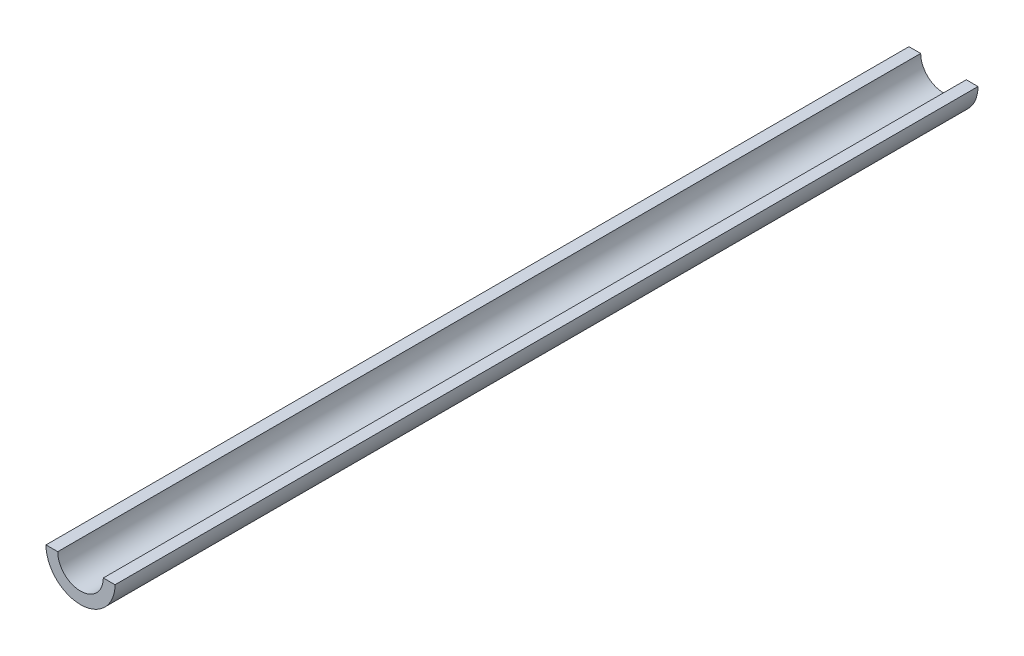
ISO-10303-21;
HEADER;
FILE_DESCRIPTION(('STEP AP214'),'2;1');
FILE_NAME('part.step','',(''),(''),'','','');
FILE_SCHEMA(('AUTOMOTIVE_DESIGN { 1 0 10303 214 1 1 1 1 }'));
ENDSEC;
DATA;
#1=APPLICATION_CONTEXT('core data for automotive mechanical design processes');
#2=APPLICATION_PROTOCOL_DEFINITION('international standard','automotive_design',2000,#1);
#3=PRODUCT_CONTEXT('',#1,'mechanical');
#4=PRODUCT('Part','Part','',(#3));
#5=PRODUCT_RELATED_PRODUCT_CATEGORY('part','',(#4));
#6=PRODUCT_DEFINITION_FORMATION('','',#4);
#7=PRODUCT_DEFINITION_CONTEXT('part definition',#1,'design');
#8=PRODUCT_DEFINITION('design','',#6,#7);
#9=PRODUCT_DEFINITION_SHAPE('','',#8);
#10=(LENGTH_UNIT() NAMED_UNIT(*) SI_UNIT(.MILLI.,.METRE.));
#11=(NAMED_UNIT(*) PLANE_ANGLE_UNIT() SI_UNIT($,.RADIAN.));
#12=(NAMED_UNIT(*) SI_UNIT($,.STERADIAN.) SOLID_ANGLE_UNIT());
#13=UNCERTAINTY_MEASURE_WITH_UNIT(LENGTH_MEASURE(1.E-05),#10,'distance_accuracy_value','');
#14=(GEOMETRIC_REPRESENTATION_CONTEXT(3) GLOBAL_UNCERTAINTY_ASSIGNED_CONTEXT((#13)) GLOBAL_UNIT_ASSIGNED_CONTEXT((#10,
#11,#12)) REPRESENTATION_CONTEXT('',''));
#15=CARTESIAN_POINT('',(0.,0.,0.));
#16=DIRECTION('',(0.,0.,1.));
#17=DIRECTION('',(1.,0.,0.));
#18=AXIS2_PLACEMENT_3D('',#15,#16,#17);
#19=CARTESIAN_POINT('',(0.,0.,250.));
#20=DIRECTION('',(0.,0.,-1.));
#21=DIRECTION('',(-1.,0.,0.));
#22=AXIS2_PLACEMENT_3D('',#19,#20,#21);
#23=CYLINDRICAL_SURFACE('',#22,6.6);
#24=CARTESIAN_POINT('',(0.,0.,0.));
#25=DIRECTION('',(0.,0.,-1.));
#26=DIRECTION('',(1.,0.,0.));
#27=AXIS2_PLACEMENT_3D('',#24,#25,#26);
#28=CIRCLE('',#27,6.6);
#29=CARTESIAN_POINT('',(6.6,0.,0.));
#30=VERTEX_POINT('',#29);
#31=CARTESIAN_POINT('',(-6.6,0.,0.));
#32=VERTEX_POINT('',#31);
#33=EDGE_CURVE('E113',#30,#32,#28,.T.);
#34=ORIENTED_EDGE('',*,*,#33,.T.);
#35=DIRECTION('',(0.,0.,-1.));
#36=VECTOR('',#35,1.);
#37=CARTESIAN_POINT('',(-6.6,0.,250.));
#38=LINE('',#37,#36);
#39=CARTESIAN_POINT('',(-6.6,0.,250.));
#40=VERTEX_POINT('',#39);
#41=EDGE_CURVE('E11',#40,#32,#38,.T.);
#42=ORIENTED_EDGE('',*,*,#41,.F.);
#43=CARTESIAN_POINT('',(0.,0.,250.));
#44=DIRECTION('',(0.,0.,-1.));
#45=DIRECTION('',(1.,0.,0.));
#46=AXIS2_PLACEMENT_3D('',#43,#44,#45);
#47=CIRCLE('',#46,6.6);
#48=CARTESIAN_POINT('',(6.6,0.,250.));
#49=VERTEX_POINT('',#48);
#50=EDGE_CURVE('E97',#49,#40,#47,.T.);
#51=ORIENTED_EDGE('',*,*,#50,.F.);
#52=DIRECTION('',(0.,0.,-1.));
#53=VECTOR('',#52,1.);
#54=CARTESIAN_POINT('',(6.6,0.,250.));
#55=LINE('',#54,#53);
#56=EDGE_CURVE('E109',#49,#30,#55,.T.);
#57=ORIENTED_EDGE('',*,*,#56,.T.);
#58=EDGE_LOOP('',(#34,#42,#51,#57));
#59=FACE_BOUND('',#58,.T.);
#60=ADVANCED_FACE('F45',(#59),#23,.F.);
#61=CARTESIAN_POINT('',(-10.,0.,250.));
#62=DIRECTION('',(0.,-1.,0.));
#63=DIRECTION('',(0.,0.,-1.));
#64=AXIS2_PLACEMENT_3D('',#61,#62,#63);
#65=PLANE('',#64);
#66=DIRECTION('',(-1.,0.,0.));
#67=VECTOR('',#66,1.);
#68=CARTESIAN_POINT('',(-10.,0.,0.));
#69=LINE('',#68,#67);
#70=CARTESIAN_POINT('',(-10.,0.,0.));
#71=VERTEX_POINT('',#70);
#72=EDGE_CURVE('E102',#32,#71,#69,.T.);
#73=ORIENTED_EDGE('',*,*,#72,.T.);
#74=DIRECTION('',(0.,0.,-1.));
#75=VECTOR('',#74,1.);
#76=CARTESIAN_POINT('',(-10.,0.,250.));
#77=LINE('',#76,#75);
#78=CARTESIAN_POINT('',(-10.,0.,250.));
#79=VERTEX_POINT('',#78);
#80=EDGE_CURVE('E54',#79,#71,#77,.T.);
#81=ORIENTED_EDGE('',*,*,#80,.F.);
#82=DIRECTION('',(-1.,0.,0.));
#83=VECTOR('',#82,1.);
#84=CARTESIAN_POINT('',(-10.,0.,250.));
#85=LINE('',#84,#83);
#86=EDGE_CURVE('E92',#40,#79,#85,.T.);
#87=ORIENTED_EDGE('',*,*,#86,.F.);
#88=ORIENTED_EDGE('',*,*,#41,.T.);
#89=EDGE_LOOP('',(#73,#81,#87,#88));
#90=FACE_BOUND('',#89,.T.);
#91=ADVANCED_FACE('F101',(#90),#65,.F.);
#92=CARTESIAN_POINT('',(0.,0.,250.));
#93=DIRECTION('',(0.,0.,-1.));
#94=DIRECTION('',(-1.,0.,0.));
#95=AXIS2_PLACEMENT_3D('',#92,#93,#94);
#96=CYLINDRICAL_SURFACE('',#95,10.);
#97=CARTESIAN_POINT('',(0.,0.,0.));
#98=DIRECTION('',(0.,0.,1.));
#99=DIRECTION('',(1.,0.,0.));
#100=AXIS2_PLACEMENT_3D('',#97,#98,#99);
#101=CIRCLE('',#100,10.);
#102=CARTESIAN_POINT('',(10.,0.,0.));
#103=VERTEX_POINT('',#102);
#104=EDGE_CURVE('E79',#71,#103,#101,.T.);
#105=ORIENTED_EDGE('',*,*,#104,.T.);
#106=DIRECTION('',(0.,0.,-1.));
#107=VECTOR('',#106,1.);
#108=CARTESIAN_POINT('',(10.,0.,250.));
#109=LINE('',#108,#107);
#110=CARTESIAN_POINT('',(10.,0.,250.));
#111=VERTEX_POINT('',#110);
#112=EDGE_CURVE('E104',#111,#103,#109,.T.);
#113=ORIENTED_EDGE('',*,*,#112,.F.);
#114=CARTESIAN_POINT('',(0.,0.,250.));
#115=DIRECTION('',(0.,0.,1.));
#116=DIRECTION('',(1.,0.,0.));
#117=AXIS2_PLACEMENT_3D('',#114,#115,#116);
#118=CIRCLE('',#117,10.);
#119=EDGE_CURVE('E95',#79,#111,#118,.T.);
#120=ORIENTED_EDGE('',*,*,#119,.F.);
#121=ORIENTED_EDGE('',*,*,#80,.T.);
#122=EDGE_LOOP('',(#105,#113,#120,#121));
#123=FACE_BOUND('',#122,.T.);
#124=ADVANCED_FACE('F105',(#123),#96,.T.);
#125=CARTESIAN_POINT('',(6.6,0.,250.));
#126=DIRECTION('',(0.,-1.,0.));
#127=DIRECTION('',(0.,0.,-1.));
#128=AXIS2_PLACEMENT_3D('',#125,#126,#127);
#129=PLANE('',#128);
#130=DIRECTION('',(-1.,0.,0.));
#131=VECTOR('',#130,1.);
#132=CARTESIAN_POINT('',(6.6,0.,0.));
#133=LINE('',#132,#131);
#134=EDGE_CURVE('E85',#103,#30,#133,.T.);
#135=ORIENTED_EDGE('',*,*,#134,.T.);
#136=ORIENTED_EDGE('',*,*,#56,.F.);
#137=DIRECTION('',(-1.,0.,0.));
#138=VECTOR('',#137,1.);
#139=CARTESIAN_POINT('',(6.6,0.,250.));
#140=LINE('',#139,#138);
#141=EDGE_CURVE('E62',#111,#49,#140,.T.);
#142=ORIENTED_EDGE('',*,*,#141,.F.);
#143=ORIENTED_EDGE('',*,*,#112,.T.);
#144=EDGE_LOOP('',(#135,#136,#142,#143));
#145=FACE_BOUND('',#144,.T.);
#146=ADVANCED_FACE('F126',(#145),#129,.F.);
#147=CARTESIAN_POINT('',(0.,0.,250.));
#148=DIRECTION('',(0.,0.,1.));
#149=DIRECTION('',(1.,0.,0.));
#150=AXIS2_PLACEMENT_3D('',#147,#148,#149);
#151=PLANE('',#150);
#152=ORIENTED_EDGE('',*,*,#50,.T.);
#153=ORIENTED_EDGE('',*,*,#86,.T.);
#154=ORIENTED_EDGE('',*,*,#119,.T.);
#155=ORIENTED_EDGE('',*,*,#141,.T.);
#156=EDGE_LOOP('',(#152,#153,#154,#155));
#157=FACE_BOUND('',#156,.T.);
#158=ADVANCED_FACE('F93',(#157),#151,.T.);
#159=CARTESIAN_POINT('',(0.,0.,0.));
#160=DIRECTION('',(0.,0.,1.));
#161=DIRECTION('',(1.,0.,0.));
#162=AXIS2_PLACEMENT_3D('',#159,#160,#161);
#163=PLANE('',#162);
#164=ORIENTED_EDGE('',*,*,#33,.F.);
#165=ORIENTED_EDGE('',*,*,#134,.F.);
#166=ORIENTED_EDGE('',*,*,#104,.F.);
#167=ORIENTED_EDGE('',*,*,#72,.F.);
#168=EDGE_LOOP('',(#164,#165,#166,#167));
#169=FACE_BOUND('',#168,.T.);
#170=ADVANCED_FACE('F129',(#169),#163,.F.);
#171=CLOSED_SHELL('',(#60,#91,#124,#146,#158,#170));
#172=MANIFOLD_SOLID_BREP('B2',#171);
#173=ADVANCED_BREP_SHAPE_REPRESENTATION('',(#18,#172),#14);
#174=SHAPE_DEFINITION_REPRESENTATION(#9,#173);
ENDSEC;
END-ISO-10303-21;
